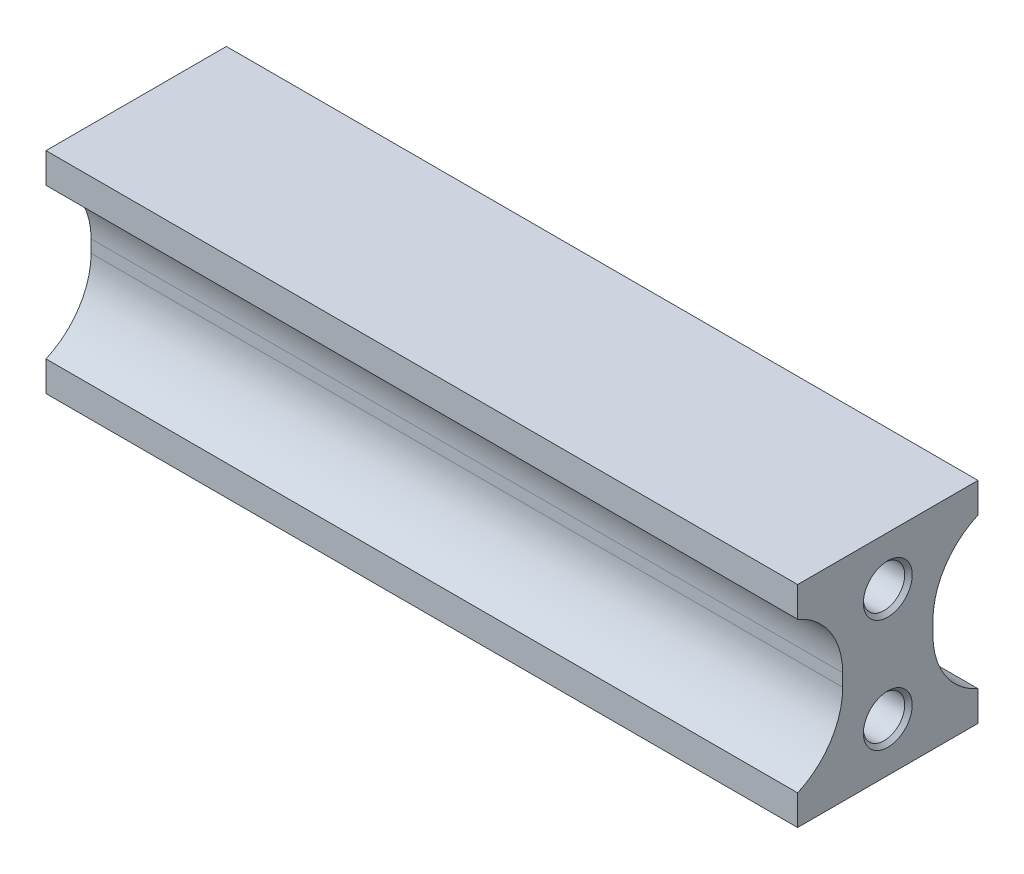
ISO-10303-21;
HEADER;
FILE_DESCRIPTION(('STEP AP214'),'2;1');
FILE_NAME('part.step','',(''),(''),'','','');
FILE_SCHEMA(('AUTOMOTIVE_DESIGN { 1 0 10303 214 1 1 1 1 }'));
ENDSEC;
DATA;
#1=APPLICATION_CONTEXT('core data for automotive mechanical design processes');
#2=APPLICATION_PROTOCOL_DEFINITION('international standard','automotive_design',2000,#1);
#3=PRODUCT_CONTEXT('',#1,'mechanical');
#4=PRODUCT('Part','Part','',(#3));
#5=PRODUCT_RELATED_PRODUCT_CATEGORY('part','',(#4));
#6=PRODUCT_DEFINITION_FORMATION('','',#4);
#7=PRODUCT_DEFINITION_CONTEXT('part definition',#1,'design');
#8=PRODUCT_DEFINITION('design','',#6,#7);
#9=PRODUCT_DEFINITION_SHAPE('','',#8);
#10=(LENGTH_UNIT() NAMED_UNIT(*) SI_UNIT(.MILLI.,.METRE.));
#11=(NAMED_UNIT(*) PLANE_ANGLE_UNIT() SI_UNIT($,.RADIAN.));
#12=(NAMED_UNIT(*) SI_UNIT($,.STERADIAN.) SOLID_ANGLE_UNIT());
#13=UNCERTAINTY_MEASURE_WITH_UNIT(LENGTH_MEASURE(1.E-05),#10,'distance_accuracy_value','');
#14=(GEOMETRIC_REPRESENTATION_CONTEXT(3) GLOBAL_UNCERTAINTY_ASSIGNED_CONTEXT((#13)) GLOBAL_UNIT_ASSIGNED_CONTEXT((#10,
#11,#12)) REPRESENTATION_CONTEXT('',''));
#15=CARTESIAN_POINT('',(0.,0.,0.));
#16=DIRECTION('',(0.,0.,1.));
#17=DIRECTION('',(1.,0.,0.));
#18=AXIS2_PLACEMENT_3D('',#15,#16,#17);
#19=CARTESIAN_POINT('',(100.,0.,0.));
#20=DIRECTION('',(1.,0.,0.));
#21=DIRECTION('',(0.,0.,-1.));
#22=AXIS2_PLACEMENT_3D('',#19,#20,#21);
#23=PLANE('',#22);
#24=CARTESIAN_POINT('',(100.,6.5,0.));
#25=DIRECTION('',(1.,0.,0.));
#26=DIRECTION('',(0.,0.,-1.));
#27=AXIS2_PLACEMENT_3D('',#24,#25,#26);
#28=CIRCLE('',#27,3.25000000000002);
#29=CARTESIAN_POINT('',(100.,6.5,-3.25000000000002));
#30=VERTEX_POINT('',#29);
#31=EDGE_CURVE('E181',#30,#30,#28,.F.);
#32=ORIENTED_EDGE('',*,*,#31,.T.);
#33=EDGE_LOOP('',(#32));
#34=FACE_BOUND('',#33,.T.);
#35=CARTESIAN_POINT('',(100.,21.5,0.));
#36=DIRECTION('',(1.,0.,0.));
#37=DIRECTION('',(0.,0.,-1.));
#38=AXIS2_PLACEMENT_3D('',#35,#36,#37);
#39=CIRCLE('',#38,3.25000000000002);
#40=CARTESIAN_POINT('',(100.,21.5,-3.25000000000002));
#41=VERTEX_POINT('',#40);
#42=EDGE_CURVE('E178',#41,#41,#39,.F.);
#43=ORIENTED_EDGE('',*,*,#42,.T.);
#44=EDGE_LOOP('',(#43));
#45=FACE_BOUND('',#44,.T.);
#46=DIRECTION('',(0.,1.,0.));
#47=VECTOR('',#46,1.);
#48=CARTESIAN_POINT('',(100.,0.,-12.));
#49=LINE('',#48,#47);
#50=CARTESIAN_POINT('',(100.,0.,-12.));
#51=VERTEX_POINT('',#50);
#52=CARTESIAN_POINT('',(100.,4.,-12.));
#53=VERTEX_POINT('',#52);
#54=EDGE_CURVE('E126',#51,#53,#49,.T.);
#55=ORIENTED_EDGE('',*,*,#54,.T.);
#56=CARTESIAN_POINT('',(100.,13.1651513899117,-16.));
#57=DIRECTION('',(1.,0.,0.));
#58=DIRECTION('',(0.,0.,-1.));
#59=AXIS2_PLACEMENT_3D('',#56,#57,#58);
#60=CIRCLE('',#59,10.);
#61=CARTESIAN_POINT('',(100.,13.1651513899117,-6.));
#62=VERTEX_POINT('',#61);
#63=EDGE_CURVE('E130',#53,#62,#60,.F.);
#64=ORIENTED_EDGE('',*,*,#63,.T.);
#65=DIRECTION('',(0.,1.,0.));
#66=VECTOR('',#65,1.);
#67=CARTESIAN_POINT('',(100.,4.,-6.));
#68=LINE('',#67,#66);
#69=CARTESIAN_POINT('',(100.,14.8348486100883,-6.));
#70=VERTEX_POINT('',#69);
#71=EDGE_CURVE('E137',#62,#70,#68,.T.);
#72=ORIENTED_EDGE('',*,*,#71,.T.);
#73=CARTESIAN_POINT('',(100.,14.8348486100883,-16.));
#74=DIRECTION('',(1.,0.,0.));
#75=DIRECTION('',(0.,0.,-1.));
#76=AXIS2_PLACEMENT_3D('',#73,#74,#75);
#77=CIRCLE('',#76,10.);
#78=CARTESIAN_POINT('',(100.,24.,-12.));
#79=VERTEX_POINT('',#78);
#80=EDGE_CURVE('E158',#70,#79,#77,.F.);
#81=ORIENTED_EDGE('',*,*,#80,.T.);
#82=DIRECTION('',(0.,1.,0.));
#83=VECTOR('',#82,1.);
#84=CARTESIAN_POINT('',(100.,24.,-12.));
#85=LINE('',#84,#83);
#86=CARTESIAN_POINT('',(100.,28.,-12.));
#87=VERTEX_POINT('',#86);
#88=EDGE_CURVE('E340',#79,#87,#85,.T.);
#89=ORIENTED_EDGE('',*,*,#88,.T.);
#90=DIRECTION('',(0.,0.,1.));
#91=VECTOR('',#90,1.);
#92=CARTESIAN_POINT('',(100.,28.,-12.));
#93=LINE('',#92,#91);
#94=CARTESIAN_POINT('',(100.,28.,12.));
#95=VERTEX_POINT('',#94);
#96=EDGE_CURVE('E346',#87,#95,#93,.T.);
#97=ORIENTED_EDGE('',*,*,#96,.T.);
#98=DIRECTION('',(0.,-1.,0.));
#99=VECTOR('',#98,1.);
#100=CARTESIAN_POINT('',(100.,24.,12.));
#101=LINE('',#100,#99);
#102=CARTESIAN_POINT('',(100.,24.,12.));
#103=VERTEX_POINT('',#102);
#104=EDGE_CURVE('E352',#95,#103,#101,.T.);
#105=ORIENTED_EDGE('',*,*,#104,.T.);
#106=CARTESIAN_POINT('',(100.,14.8348486100883,16.));
#107=DIRECTION('',(1.,0.,0.));
#108=DIRECTION('',(0.,0.,-1.));
#109=AXIS2_PLACEMENT_3D('',#106,#107,#108);
#110=CIRCLE('',#109,10.);
#111=CARTESIAN_POINT('',(100.,14.8348486100883,6.));
#112=VERTEX_POINT('',#111);
#113=EDGE_CURVE('E60',#103,#112,#110,.F.);
#114=ORIENTED_EDGE('',*,*,#113,.T.);
#115=DIRECTION('',(0.,-1.,0.));
#116=VECTOR('',#115,1.);
#117=CARTESIAN_POINT('',(100.,4.,6.));
#118=LINE('',#117,#116);
#119=CARTESIAN_POINT('',(100.,13.1651513899117,6.));
#120=VERTEX_POINT('',#119);
#121=EDGE_CURVE('E354',#112,#120,#118,.T.);
#122=ORIENTED_EDGE('',*,*,#121,.T.);
#123=CARTESIAN_POINT('',(100.,13.1651513899117,16.));
#124=DIRECTION('',(1.,0.,0.));
#125=DIRECTION('',(0.,0.,-1.));
#126=AXIS2_PLACEMENT_3D('',#123,#124,#125);
#127=CIRCLE('',#126,10.);
#128=CARTESIAN_POINT('',(100.,4.,12.));
#129=VERTEX_POINT('',#128);
#130=EDGE_CURVE('E156',#120,#129,#127,.F.);
#131=ORIENTED_EDGE('',*,*,#130,.T.);
#132=DIRECTION('',(0.,-1.,0.));
#133=VECTOR('',#132,1.);
#134=CARTESIAN_POINT('',(100.,0.,12.));
#135=LINE('',#134,#133);
#136=CARTESIAN_POINT('',(100.,0.,12.));
#137=VERTEX_POINT('',#136);
#138=EDGE_CURVE('E355',#129,#137,#135,.T.);
#139=ORIENTED_EDGE('',*,*,#138,.T.);
#140=DIRECTION('',(0.,0.,-1.));
#141=VECTOR('',#140,1.);
#142=CARTESIAN_POINT('',(100.,0.,12.));
#143=LINE('',#142,#141);
#144=EDGE_CURVE('E133',#137,#51,#143,.T.);
#145=ORIENTED_EDGE('',*,*,#144,.T.);
#146=EDGE_LOOP('',(#55,#64,#72,#81,#89,#97,#105,#114,#122,#131,#139,#145));
#147=FACE_BOUND('',#146,.T.);
#148=ADVANCED_FACE('F37',(#34,#45,#147),#23,.T.);
#149=CARTESIAN_POINT('',(0.,0.,0.));
#150=DIRECTION('',(1.,0.,0.));
#151=DIRECTION('',(0.,0.,-1.));
#152=AXIS2_PLACEMENT_3D('',#149,#150,#151);
#153=PLANE('',#152);
#154=CARTESIAN_POINT('',(0.,6.5,0.));
#155=DIRECTION('',(1.,0.,0.));
#156=DIRECTION('',(0.,0.,-1.));
#157=AXIS2_PLACEMENT_3D('',#154,#155,#156);
#158=CIRCLE('',#157,3.25);
#159=CARTESIAN_POINT('',(0.,6.5,-3.25));
#160=VERTEX_POINT('',#159);
#161=EDGE_CURVE('E169',#160,#160,#158,.T.);
#162=ORIENTED_EDGE('',*,*,#161,.T.);
#163=EDGE_LOOP('',(#162));
#164=FACE_BOUND('',#163,.T.);
#165=CARTESIAN_POINT('',(0.,21.5,0.));
#166=DIRECTION('',(1.,0.,0.));
#167=DIRECTION('',(0.,0.,-1.));
#168=AXIS2_PLACEMENT_3D('',#165,#166,#167);
#169=CIRCLE('',#168,3.25);
#170=CARTESIAN_POINT('',(0.,21.5,-3.25));
#171=VERTEX_POINT('',#170);
#172=EDGE_CURVE('E166',#171,#171,#169,.T.);
#173=ORIENTED_EDGE('',*,*,#172,.T.);
#174=EDGE_LOOP('',(#173));
#175=FACE_BOUND('',#174,.T.);
#176=DIRECTION('',(0.,1.,0.));
#177=VECTOR('',#176,1.);
#178=CARTESIAN_POINT('',(0.,0.,-12.));
#179=LINE('',#178,#177);
#180=CARTESIAN_POINT('',(0.,0.,-12.));
#181=VERTEX_POINT('',#180);
#182=CARTESIAN_POINT('',(0.,4.,-12.));
#183=VERTEX_POINT('',#182);
#184=EDGE_CURVE('E145',#181,#183,#179,.T.);
#185=ORIENTED_EDGE('',*,*,#184,.F.);
#186=DIRECTION('',(0.,0.,-1.));
#187=VECTOR('',#186,1.);
#188=CARTESIAN_POINT('',(0.,0.,12.));
#189=LINE('',#188,#187);
#190=CARTESIAN_POINT('',(0.,0.,12.));
#191=VERTEX_POINT('',#190);
#192=EDGE_CURVE('E138',#191,#181,#189,.T.);
#193=ORIENTED_EDGE('',*,*,#192,.F.);
#194=DIRECTION('',(0.,-1.,0.));
#195=VECTOR('',#194,1.);
#196=CARTESIAN_POINT('',(0.,0.,12.));
#197=LINE('',#196,#195);
#198=CARTESIAN_POINT('',(0.,4.,12.));
#199=VERTEX_POINT('',#198);
#200=EDGE_CURVE('E308',#199,#191,#197,.T.);
#201=ORIENTED_EDGE('',*,*,#200,.F.);
#202=CARTESIAN_POINT('',(0.,13.1651513899117,16.));
#203=DIRECTION('',(1.,0.,0.));
#204=DIRECTION('',(0.,0.,-1.));
#205=AXIS2_PLACEMENT_3D('',#202,#203,#204);
#206=CIRCLE('',#205,10.);
#207=CARTESIAN_POINT('',(0.,13.1651513899117,6.));
#208=VERTEX_POINT('',#207);
#209=EDGE_CURVE('E153',#199,#208,#206,.T.);
#210=ORIENTED_EDGE('',*,*,#209,.T.);
#211=DIRECTION('',(0.,-1.,0.));
#212=VECTOR('',#211,1.);
#213=CARTESIAN_POINT('',(0.,4.,6.));
#214=LINE('',#213,#212);
#215=CARTESIAN_POINT('',(0.,14.8348486100883,6.));
#216=VERTEX_POINT('',#215);
#217=EDGE_CURVE('E306',#216,#208,#214,.T.);
#218=ORIENTED_EDGE('',*,*,#217,.F.);
#219=CARTESIAN_POINT('',(0.,14.8348486100883,16.));
#220=DIRECTION('',(1.,0.,0.));
#221=DIRECTION('',(0.,0.,-1.));
#222=AXIS2_PLACEMENT_3D('',#219,#220,#221);
#223=CIRCLE('',#222,10.);
#224=CARTESIAN_POINT('',(0.,24.,12.));
#225=VERTEX_POINT('',#224);
#226=EDGE_CURVE('E163',#216,#225,#223,.T.);
#227=ORIENTED_EDGE('',*,*,#226,.T.);
#228=DIRECTION('',(0.,-1.,0.));
#229=VECTOR('',#228,1.);
#230=CARTESIAN_POINT('',(0.,24.,12.));
#231=LINE('',#230,#229);
#232=CARTESIAN_POINT('',(0.,28.,12.));
#233=VERTEX_POINT('',#232);
#234=EDGE_CURVE('E303',#233,#225,#231,.T.);
#235=ORIENTED_EDGE('',*,*,#234,.F.);
#236=DIRECTION('',(0.,0.,1.));
#237=VECTOR('',#236,1.);
#238=CARTESIAN_POINT('',(0.,28.,-12.));
#239=LINE('',#238,#237);
#240=CARTESIAN_POINT('',(0.,28.,-12.));
#241=VERTEX_POINT('',#240);
#242=EDGE_CURVE('E301',#241,#233,#239,.T.);
#243=ORIENTED_EDGE('',*,*,#242,.F.);
#244=DIRECTION('',(0.,1.,0.));
#245=VECTOR('',#244,1.);
#246=CARTESIAN_POINT('',(0.,24.,-12.));
#247=LINE('',#246,#245);
#248=CARTESIAN_POINT('',(0.,24.,-12.));
#249=VERTEX_POINT('',#248);
#250=EDGE_CURVE('E295',#249,#241,#247,.T.);
#251=ORIENTED_EDGE('',*,*,#250,.F.);
#252=CARTESIAN_POINT('',(0.,14.8348486100883,-16.));
#253=DIRECTION('',(1.,0.,0.));
#254=DIRECTION('',(0.,0.,-1.));
#255=AXIS2_PLACEMENT_3D('',#252,#253,#254);
#256=CIRCLE('',#255,10.);
#257=CARTESIAN_POINT('',(0.,14.8348486100883,-6.));
#258=VERTEX_POINT('',#257);
#259=EDGE_CURVE('E337',#249,#258,#256,.T.);
#260=ORIENTED_EDGE('',*,*,#259,.T.);
#261=DIRECTION('',(0.,1.,0.));
#262=VECTOR('',#261,1.);
#263=CARTESIAN_POINT('',(0.,4.,-6.));
#264=LINE('',#263,#262);
#265=CARTESIAN_POINT('',(0.,13.1651513899117,-6.));
#266=VERTEX_POINT('',#265);
#267=EDGE_CURVE('E292',#266,#258,#264,.T.);
#268=ORIENTED_EDGE('',*,*,#267,.F.);
#269=CARTESIAN_POINT('',(0.,13.1651513899117,-16.));
#270=DIRECTION('',(1.,0.,0.));
#271=DIRECTION('',(0.,0.,-1.));
#272=AXIS2_PLACEMENT_3D('',#269,#270,#271);
#273=CIRCLE('',#272,10.);
#274=EDGE_CURVE('E154',#266,#183,#273,.T.);
#275=ORIENTED_EDGE('',*,*,#274,.T.);
#276=EDGE_LOOP('',(#185,#193,#201,#210,#218,#227,#235,#243,#251,#260,#268,#275));
#277=FACE_BOUND('',#276,.T.);
#278=ADVANCED_FACE('F198',(#164,#175,#277),#153,.F.);
#279=CARTESIAN_POINT('',(100.,0.,-12.));
#280=DIRECTION('',(0.,0.,1.));
#281=DIRECTION('',(1.,0.,0.));
#282=AXIS2_PLACEMENT_3D('',#279,#280,#281);
#283=PLANE('',#282);
#284=ORIENTED_EDGE('',*,*,#184,.T.);
#285=DIRECTION('',(-1.,0.,0.));
#286=VECTOR('',#285,1.);
#287=CARTESIAN_POINT('',(100.,4.,-12.));
#288=LINE('',#287,#286);
#289=EDGE_CURVE('E142',#53,#183,#288,.T.);
#290=ORIENTED_EDGE('',*,*,#289,.F.);
#291=ORIENTED_EDGE('',*,*,#54,.F.);
#292=DIRECTION('',(-1.,0.,0.));
#293=VECTOR('',#292,1.);
#294=CARTESIAN_POINT('',(100.,0.,-12.));
#295=LINE('',#294,#293);
#296=EDGE_CURVE('E311',#51,#181,#295,.T.);
#297=ORIENTED_EDGE('',*,*,#296,.T.);
#298=EDGE_LOOP('',(#284,#290,#291,#297));
#299=FACE_BOUND('',#298,.T.);
#300=ADVANCED_FACE('F143',(#299),#283,.F.);
#301=CARTESIAN_POINT('',(100.,4.,-6.));
#302=DIRECTION('',(0.,0.,1.));
#303=DIRECTION('',(0.,-1.,0.));
#304=AXIS2_PLACEMENT_3D('',#301,#302,#303);
#305=PLANE('',#304);
#306=ORIENTED_EDGE('',*,*,#267,.T.);
#307=DIRECTION('',(1.,0.,0.));
#308=VECTOR('',#307,1.);
#309=CARTESIAN_POINT('',(100.,14.8348486100883,-6.));
#310=LINE('',#309,#308);
#311=EDGE_CURVE('E331',#258,#70,#310,.T.);
#312=ORIENTED_EDGE('',*,*,#311,.T.);
#313=ORIENTED_EDGE('',*,*,#71,.F.);
#314=DIRECTION('',(-1.,0.,0.));
#315=VECTOR('',#314,1.);
#316=CARTESIAN_POINT('',(100.,13.1651513899117,-6.));
#317=LINE('',#316,#315);
#318=EDGE_CURVE('E147',#62,#266,#317,.T.);
#319=ORIENTED_EDGE('',*,*,#318,.T.);
#320=EDGE_LOOP('',(#306,#312,#313,#319));
#321=FACE_BOUND('',#320,.T.);
#322=ADVANCED_FACE('F232',(#321),#305,.F.);
#323=CARTESIAN_POINT('',(100.,24.,-12.));
#324=DIRECTION('',(0.,0.,1.));
#325=DIRECTION('',(1.,0.,0.));
#326=AXIS2_PLACEMENT_3D('',#323,#324,#325);
#327=PLANE('',#326);
#328=ORIENTED_EDGE('',*,*,#250,.T.);
#329=DIRECTION('',(-1.,0.,0.));
#330=VECTOR('',#329,1.);
#331=CARTESIAN_POINT('',(100.,28.,-12.));
#332=LINE('',#331,#330);
#333=EDGE_CURVE('E325',#87,#241,#332,.T.);
#334=ORIENTED_EDGE('',*,*,#333,.F.);
#335=ORIENTED_EDGE('',*,*,#88,.F.);
#336=DIRECTION('',(-1.,0.,0.));
#337=VECTOR('',#336,1.);
#338=CARTESIAN_POINT('',(100.,24.,-12.));
#339=LINE('',#338,#337);
#340=EDGE_CURVE('E148',#79,#249,#339,.T.);
#341=ORIENTED_EDGE('',*,*,#340,.T.);
#342=EDGE_LOOP('',(#328,#334,#335,#341));
#343=FACE_BOUND('',#342,.T.);
#344=ADVANCED_FACE('F228',(#343),#327,.F.);
#345=CARTESIAN_POINT('',(100.,28.,-12.));
#346=DIRECTION('',(0.,-1.,0.));
#347=DIRECTION('',(0.,0.,-1.));
#348=AXIS2_PLACEMENT_3D('',#345,#346,#347);
#349=PLANE('',#348);
#350=ORIENTED_EDGE('',*,*,#242,.T.);
#351=DIRECTION('',(-1.,0.,0.));
#352=VECTOR('',#351,1.);
#353=CARTESIAN_POINT('',(100.,28.,12.));
#354=LINE('',#353,#352);
#355=EDGE_CURVE('E322',#95,#233,#354,.T.);
#356=ORIENTED_EDGE('',*,*,#355,.F.);
#357=ORIENTED_EDGE('',*,*,#96,.F.);
#358=ORIENTED_EDGE('',*,*,#333,.T.);
#359=EDGE_LOOP('',(#350,#356,#357,#358));
#360=FACE_BOUND('',#359,.T.);
#361=ADVANCED_FACE('F224',(#360),#349,.F.);
#362=CARTESIAN_POINT('',(100.,24.,12.));
#363=DIRECTION('',(0.,0.,-1.));
#364=DIRECTION('',(-1.,0.,0.));
#365=AXIS2_PLACEMENT_3D('',#362,#363,#364);
#366=PLANE('',#365);
#367=ORIENTED_EDGE('',*,*,#234,.T.);
#368=DIRECTION('',(-1.,0.,0.));
#369=VECTOR('',#368,1.);
#370=CARTESIAN_POINT('',(100.,24.,12.));
#371=LINE('',#370,#369);
#372=EDGE_CURVE('E319',#103,#225,#371,.T.);
#373=ORIENTED_EDGE('',*,*,#372,.F.);
#374=ORIENTED_EDGE('',*,*,#104,.F.);
#375=ORIENTED_EDGE('',*,*,#355,.T.);
#376=EDGE_LOOP('',(#367,#373,#374,#375));
#377=FACE_BOUND('',#376,.T.);
#378=ADVANCED_FACE('F221',(#377),#366,.F.);
#379=CARTESIAN_POINT('',(100.,4.,6.));
#380=DIRECTION('',(0.,0.,-1.));
#381=DIRECTION('',(-1.,0.,0.));
#382=AXIS2_PLACEMENT_3D('',#379,#380,#381);
#383=PLANE('',#382);
#384=ORIENTED_EDGE('',*,*,#217,.T.);
#385=DIRECTION('',(1.,0.,0.));
#386=VECTOR('',#385,1.);
#387=CARTESIAN_POINT('',(100.,13.1651513899117,6.));
#388=LINE('',#387,#386);
#389=EDGE_CURVE('E53',#208,#120,#388,.T.);
#390=ORIENTED_EDGE('',*,*,#389,.T.);
#391=ORIENTED_EDGE('',*,*,#121,.F.);
#392=DIRECTION('',(-1.,0.,0.));
#393=VECTOR('',#392,1.);
#394=CARTESIAN_POINT('',(100.,14.8348486100883,6.));
#395=LINE('',#394,#393);
#396=EDGE_CURVE('E333',#112,#216,#395,.T.);
#397=ORIENTED_EDGE('',*,*,#396,.T.);
#398=EDGE_LOOP('',(#384,#390,#391,#397));
#399=FACE_BOUND('',#398,.T.);
#400=ADVANCED_FACE('F217',(#399),#383,.F.);
#401=CARTESIAN_POINT('',(100.,0.,12.));
#402=DIRECTION('',(0.,0.,-1.));
#403=DIRECTION('',(-1.,0.,0.));
#404=AXIS2_PLACEMENT_3D('',#401,#402,#403);
#405=PLANE('',#404);
#406=ORIENTED_EDGE('',*,*,#200,.T.);
#407=DIRECTION('',(-1.,0.,0.));
#408=VECTOR('',#407,1.);
#409=CARTESIAN_POINT('',(100.,0.,12.));
#410=LINE('',#409,#408);
#411=EDGE_CURVE('E313',#137,#191,#410,.T.);
#412=ORIENTED_EDGE('',*,*,#411,.F.);
#413=ORIENTED_EDGE('',*,*,#138,.F.);
#414=DIRECTION('',(-1.,0.,0.));
#415=VECTOR('',#414,1.);
#416=CARTESIAN_POINT('',(100.,4.,12.));
#417=LINE('',#416,#415);
#418=EDGE_CURVE('E316',#129,#199,#417,.T.);
#419=ORIENTED_EDGE('',*,*,#418,.T.);
#420=EDGE_LOOP('',(#406,#412,#413,#419));
#421=FACE_BOUND('',#420,.T.);
#422=ADVANCED_FACE('F213',(#421),#405,.F.);
#423=CARTESIAN_POINT('',(100.,0.,12.));
#424=DIRECTION('',(0.,1.,0.));
#425=DIRECTION('',(0.,0.,1.));
#426=AXIS2_PLACEMENT_3D('',#423,#424,#425);
#427=PLANE('',#426);
#428=ORIENTED_EDGE('',*,*,#192,.T.);
#429=ORIENTED_EDGE('',*,*,#296,.F.);
#430=ORIENTED_EDGE('',*,*,#144,.F.);
#431=ORIENTED_EDGE('',*,*,#411,.T.);
#432=EDGE_LOOP('',(#428,#429,#430,#431));
#433=FACE_BOUND('',#432,.T.);
#434=ADVANCED_FACE('F210',(#433),#427,.F.);
#435=CARTESIAN_POINT('',(100.,21.5,0.));
#436=DIRECTION('',(-1.,0.,0.));
#437=DIRECTION('',(0.,0.,1.));
#438=AXIS2_PLACEMENT_3D('',#435,#436,#437);
#439=CYLINDRICAL_SURFACE('',#438,2.75);
#440=CARTESIAN_POINT('',(0.500000000000014,21.5,0.));
#441=DIRECTION('',(1.,0.,0.));
#442=DIRECTION('',(0.,0.,-1.));
#443=AXIS2_PLACEMENT_3D('',#440,#441,#442);
#444=CIRCLE('',#443,2.75);
#445=CARTESIAN_POINT('',(0.500000000000014,21.5,-2.75));
#446=VERTEX_POINT('',#445);
#447=EDGE_CURVE('E11',#446,#446,#444,.F.);
#448=ORIENTED_EDGE('',*,*,#447,.T.);
#449=EDGE_LOOP('',(#448));
#450=FACE_BOUND('',#449,.T.);
#451=CARTESIAN_POINT('',(99.5,21.5,0.));
#452=DIRECTION('',(1.,0.,0.));
#453=DIRECTION('',(0.,0.,-1.));
#454=AXIS2_PLACEMENT_3D('',#451,#452,#453);
#455=CIRCLE('',#454,2.75);
#456=CARTESIAN_POINT('',(99.5,21.5,-2.75));
#457=VERTEX_POINT('',#456);
#458=EDGE_CURVE('E46',#457,#457,#455,.T.);
#459=ORIENTED_EDGE('',*,*,#458,.T.);
#460=EDGE_LOOP('',(#459));
#461=FACE_BOUND('',#460,.T.);
#462=ADVANCED_FACE('F186',(#450,#461),#439,.F.);
#463=CARTESIAN_POINT('',(100.,6.5,0.));
#464=DIRECTION('',(-1.,0.,0.));
#465=DIRECTION('',(0.,0.,1.));
#466=AXIS2_PLACEMENT_3D('',#463,#464,#465);
#467=CYLINDRICAL_SURFACE('',#466,2.75);
#468=CARTESIAN_POINT('',(0.5,6.5,0.));
#469=DIRECTION('',(1.,0.,0.));
#470=DIRECTION('',(0.,0.,-1.));
#471=AXIS2_PLACEMENT_3D('',#468,#469,#470);
#472=CIRCLE('',#471,2.75);
#473=CARTESIAN_POINT('',(0.5,6.5,-2.75));
#474=VERTEX_POINT('',#473);
#475=EDGE_CURVE('E175',#474,#474,#472,.F.);
#476=ORIENTED_EDGE('',*,*,#475,.T.);
#477=EDGE_LOOP('',(#476));
#478=FACE_BOUND('',#477,.T.);
#479=CARTESIAN_POINT('',(99.5,6.5,0.));
#480=DIRECTION('',(1.,0.,0.));
#481=DIRECTION('',(0.,0.,-1.));
#482=AXIS2_PLACEMENT_3D('',#479,#480,#481);
#483=CIRCLE('',#482,2.75);
#484=CARTESIAN_POINT('',(99.5,6.5,-2.75));
#485=VERTEX_POINT('',#484);
#486=EDGE_CURVE('E172',#485,#485,#483,.T.);
#487=ORIENTED_EDGE('',*,*,#486,.T.);
#488=EDGE_LOOP('',(#487));
#489=FACE_BOUND('',#488,.T.);
#490=ADVANCED_FACE('F242',(#478,#489),#467,.F.);
#491=CARTESIAN_POINT('',(100.,14.8348486100883,-16.));
#492=DIRECTION('',(1.,0.,0.));
#493=DIRECTION('',(0.,0.,-1.));
#494=AXIS2_PLACEMENT_3D('',#491,#492,#493);
#495=CYLINDRICAL_SURFACE('',#494,10.);
#496=ORIENTED_EDGE('',*,*,#80,.F.);
#497=ORIENTED_EDGE('',*,*,#311,.F.);
#498=ORIENTED_EDGE('',*,*,#259,.F.);
#499=ORIENTED_EDGE('',*,*,#340,.F.);
#500=EDGE_LOOP('',(#496,#497,#498,#499));
#501=FACE_BOUND('',#500,.T.);
#502=ADVANCED_FACE('F239',(#501),#495,.F.);
#503=CARTESIAN_POINT('',(100.,13.1651513899117,-16.));
#504=DIRECTION('',(-1.,0.,0.));
#505=DIRECTION('',(0.,0.,1.));
#506=AXIS2_PLACEMENT_3D('',#503,#504,#505);
#507=CYLINDRICAL_SURFACE('',#506,10.);
#508=ORIENTED_EDGE('',*,*,#63,.F.);
#509=ORIENTED_EDGE('',*,*,#289,.T.);
#510=ORIENTED_EDGE('',*,*,#274,.F.);
#511=ORIENTED_EDGE('',*,*,#318,.F.);
#512=EDGE_LOOP('',(#508,#509,#510,#511));
#513=FACE_BOUND('',#512,.T.);
#514=ADVANCED_FACE('F151',(#513),#507,.F.);
#515=CARTESIAN_POINT('',(100.,13.1651513899117,16.));
#516=DIRECTION('',(1.,0.,0.));
#517=DIRECTION('',(0.,0.,-1.));
#518=AXIS2_PLACEMENT_3D('',#515,#516,#517);
#519=CYLINDRICAL_SURFACE('',#518,10.);
#520=ORIENTED_EDGE('',*,*,#130,.F.);
#521=ORIENTED_EDGE('',*,*,#389,.F.);
#522=ORIENTED_EDGE('',*,*,#209,.F.);
#523=ORIENTED_EDGE('',*,*,#418,.F.);
#524=EDGE_LOOP('',(#520,#521,#522,#523));
#525=FACE_BOUND('',#524,.T.);
#526=ADVANCED_FACE('F246',(#525),#519,.F.);
#527=CARTESIAN_POINT('',(100.,14.8348486100883,16.));
#528=DIRECTION('',(-1.,0.,0.));
#529=DIRECTION('',(0.,0.,1.));
#530=AXIS2_PLACEMENT_3D('',#527,#528,#529);
#531=CYLINDRICAL_SURFACE('',#530,10.);
#532=ORIENTED_EDGE('',*,*,#113,.F.);
#533=ORIENTED_EDGE('',*,*,#372,.T.);
#534=ORIENTED_EDGE('',*,*,#226,.F.);
#535=ORIENTED_EDGE('',*,*,#396,.F.);
#536=EDGE_LOOP('',(#532,#533,#534,#535));
#537=FACE_BOUND('',#536,.T.);
#538=ADVANCED_FACE('F249',(#537),#531,.F.);
#539=CARTESIAN_POINT('',(0.,6.5,0.));
#540=DIRECTION('',(-1.,0.,0.));
#541=DIRECTION('',(0.,0.,1.));
#542=AXIS2_PLACEMENT_3D('',#539,#540,#541);
#543=CONICAL_SURFACE('',#542,3.25,0.785398163397451);
#544=ORIENTED_EDGE('',*,*,#475,.F.);
#545=EDGE_LOOP('',(#544));
#546=FACE_BOUND('',#545,.T.);
#547=ORIENTED_EDGE('',*,*,#161,.F.);
#548=EDGE_LOOP('',(#547));
#549=FACE_BOUND('',#548,.T.);
#550=ADVANCED_FACE('F253',(#546,#549),#543,.F.);
#551=CARTESIAN_POINT('',(99.5,6.5,0.));
#552=DIRECTION('',(1.,0.,0.));
#553=DIRECTION('',(0.,0.,-1.));
#554=AXIS2_PLACEMENT_3D('',#551,#552,#553);
#555=CONICAL_SURFACE('',#554,2.75,0.785398163397437);
#556=ORIENTED_EDGE('',*,*,#31,.F.);
#557=EDGE_LOOP('',(#556));
#558=FACE_BOUND('',#557,.T.);
#559=ORIENTED_EDGE('',*,*,#486,.F.);
#560=EDGE_LOOP('',(#559));
#561=FACE_BOUND('',#560,.T.);
#562=ADVANCED_FACE('F194',(#558,#561),#555,.F.);
#563=CARTESIAN_POINT('',(0.,21.5,0.));
#564=DIRECTION('',(-1.,0.,0.));
#565=DIRECTION('',(0.,0.,1.));
#566=AXIS2_PLACEMENT_3D('',#563,#564,#565);
#567=CONICAL_SURFACE('',#566,3.25,0.785398163397438);
#568=ORIENTED_EDGE('',*,*,#447,.F.);
#569=EDGE_LOOP('',(#568));
#570=FACE_BOUND('',#569,.T.);
#571=ORIENTED_EDGE('',*,*,#172,.F.);
#572=EDGE_LOOP('',(#571));
#573=FACE_BOUND('',#572,.T.);
#574=ADVANCED_FACE('F189',(#570,#573),#567,.F.);
#575=CARTESIAN_POINT('',(99.5,21.5,0.));
#576=DIRECTION('',(1.,0.,0.));
#577=DIRECTION('',(0.,0.,-1.));
#578=AXIS2_PLACEMENT_3D('',#575,#576,#577);
#579=CONICAL_SURFACE('',#578,2.75,0.785398163397438);
#580=ORIENTED_EDGE('',*,*,#42,.F.);
#581=EDGE_LOOP('',(#580));
#582=FACE_BOUND('',#581,.T.);
#583=ORIENTED_EDGE('',*,*,#458,.F.);
#584=EDGE_LOOP('',(#583));
#585=FACE_BOUND('',#584,.T.);
#586=ADVANCED_FACE('F40',(#582,#585),#579,.F.);
#587=CLOSED_SHELL('',(#148,#278,#300,#322,#344,#361,#378,#400,#422,#434,#462,#490,#502,#514,
#526,#538,#550,#562,#574,#586));
#588=MANIFOLD_SOLID_BREP('B2',#587);
#589=ADVANCED_BREP_SHAPE_REPRESENTATION('',(#18,#588),#14);
#590=SHAPE_DEFINITION_REPRESENTATION(#9,#589);
ENDSEC;
END-ISO-10303-21;
